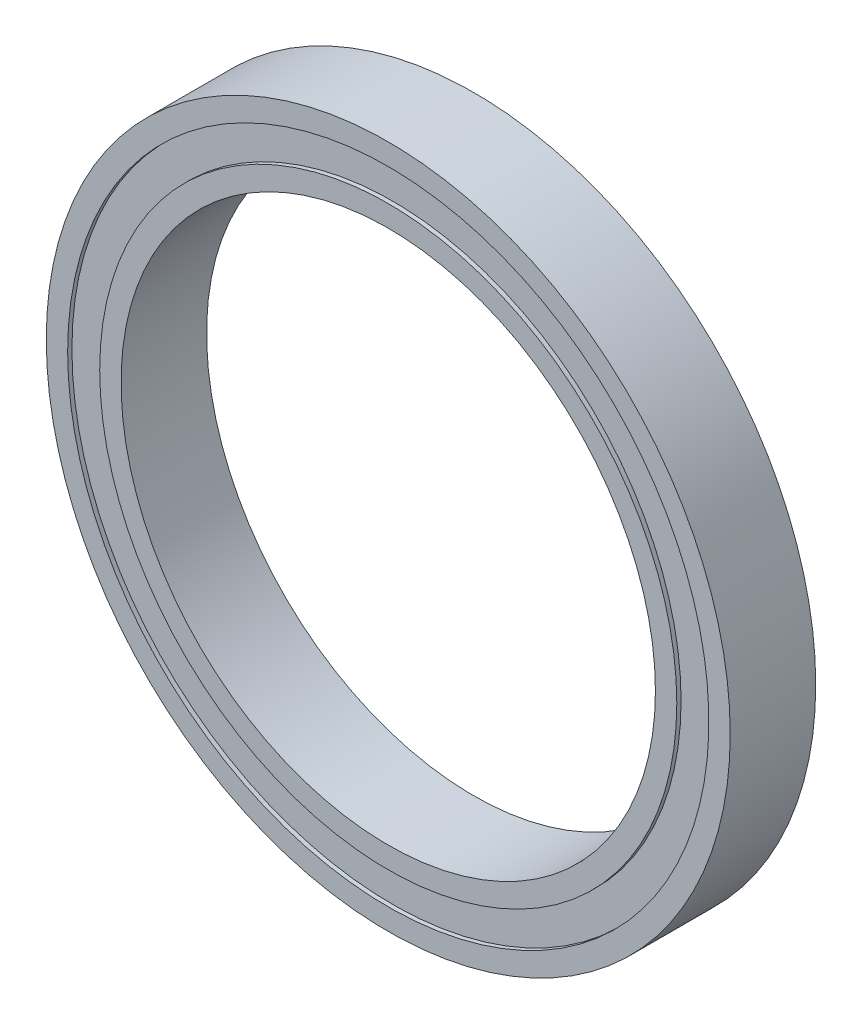
ISO-10303-21;
HEADER;
FILE_DESCRIPTION(('STEP AP214'),'2;1');
FILE_NAME('part.step','',(''),(''),'','','');
FILE_SCHEMA(('AUTOMOTIVE_DESIGN { 1 0 10303 214 1 1 1 1 }'));
ENDSEC;
DATA;
#1=APPLICATION_CONTEXT('core data for automotive mechanical design processes');
#2=APPLICATION_PROTOCOL_DEFINITION('international standard','automotive_design',2000,#1);
#3=PRODUCT_CONTEXT('',#1,'mechanical');
#4=PRODUCT('Part','Part','',(#3));
#5=PRODUCT_RELATED_PRODUCT_CATEGORY('part','',(#4));
#6=PRODUCT_DEFINITION_FORMATION('','',#4);
#7=PRODUCT_DEFINITION_CONTEXT('part definition',#1,'design');
#8=PRODUCT_DEFINITION('design','',#6,#7);
#9=PRODUCT_DEFINITION_SHAPE('','',#8);
#10=(LENGTH_UNIT() NAMED_UNIT(*) SI_UNIT(.MILLI.,.METRE.));
#11=(NAMED_UNIT(*) PLANE_ANGLE_UNIT() SI_UNIT($,.RADIAN.));
#12=(NAMED_UNIT(*) SI_UNIT($,.STERADIAN.) SOLID_ANGLE_UNIT());
#13=UNCERTAINTY_MEASURE_WITH_UNIT(LENGTH_MEASURE(1.E-05),#10,'distance_accuracy_value','');
#14=(GEOMETRIC_REPRESENTATION_CONTEXT(3) GLOBAL_UNCERTAINTY_ASSIGNED_CONTEXT((#13)) GLOBAL_UNIT_ASSIGNED_CONTEXT((#10,
#11,#12)) REPRESENTATION_CONTEXT('',''));
#15=CARTESIAN_POINT('',(0.,0.,0.));
#16=DIRECTION('',(0.,0.,1.));
#17=DIRECTION('',(1.,0.,0.));
#18=AXIS2_PLACEMENT_3D('',#15,#16,#17);
#19=CARTESIAN_POINT('',(0.,0.,2.));
#20=DIRECTION('',(0.,0.,1.));
#21=DIRECTION('',(1.,0.,0.));
#22=AXIS2_PLACEMENT_3D('',#19,#20,#21);
#23=PLANE('',#22);
#24=CARTESIAN_POINT('',(0.,0.,2.));
#25=DIRECTION('',(0.,0.,1.));
#26=DIRECTION('',(1.,0.,0.));
#27=AXIS2_PLACEMENT_3D('',#24,#25,#26);
#28=CIRCLE('',#27,12.5);
#29=CARTESIAN_POINT('',(12.5,0.,2.));
#30=VERTEX_POINT('',#29);
#31=EDGE_CURVE('E43',#30,#30,#28,.T.);
#32=ORIENTED_EDGE('',*,*,#31,.F.);
#33=EDGE_LOOP('',(#32));
#34=FACE_BOUND('',#33,.T.);
#35=CARTESIAN_POINT('',(0.,0.,2.));
#36=DIRECTION('',(0.,0.,-1.));
#37=DIRECTION('',(-1.,0.,0.));
#38=AXIS2_PLACEMENT_3D('',#35,#36,#37);
#39=CIRCLE('',#38,13.5);
#40=CARTESIAN_POINT('',(-13.5,0.,2.));
#41=VERTEX_POINT('',#40);
#42=EDGE_CURVE('E66',#41,#41,#39,.T.);
#43=ORIENTED_EDGE('',*,*,#42,.F.);
#44=EDGE_LOOP('',(#43));
#45=FACE_BOUND('',#44,.T.);
#46=ADVANCED_FACE('F32',(#34,#45),#23,.T.);
#47=CARTESIAN_POINT('',(0.,0.,-2.));
#48=DIRECTION('',(0.,0.,1.));
#49=DIRECTION('',(1.,0.,0.));
#50=AXIS2_PLACEMENT_3D('',#47,#48,#49);
#51=PLANE('',#50);
#52=CARTESIAN_POINT('',(0.,0.,-2.));
#53=DIRECTION('',(0.,0.,-1.));
#54=DIRECTION('',(-1.,0.,0.));
#55=AXIS2_PLACEMENT_3D('',#52,#53,#54);
#56=CIRCLE('',#55,13.5);
#57=CARTESIAN_POINT('',(-13.5,0.,-2.));
#58=VERTEX_POINT('',#57);
#59=EDGE_CURVE('E51',#58,#58,#56,.T.);
#60=ORIENTED_EDGE('',*,*,#59,.T.);
#61=EDGE_LOOP('',(#60));
#62=FACE_BOUND('',#61,.T.);
#63=CARTESIAN_POINT('',(0.,0.,-2.));
#64=DIRECTION('',(0.,0.,1.));
#65=DIRECTION('',(1.,0.,0.));
#66=AXIS2_PLACEMENT_3D('',#63,#64,#65);
#67=CIRCLE('',#66,12.5);
#68=CARTESIAN_POINT('',(12.5,0.,-2.));
#69=VERTEX_POINT('',#68);
#70=EDGE_CURVE('E45',#69,#69,#67,.T.);
#71=ORIENTED_EDGE('',*,*,#70,.T.);
#72=EDGE_LOOP('',(#71));
#73=FACE_BOUND('',#72,.T.);
#74=ADVANCED_FACE('F91',(#62,#73),#51,.F.);
#75=CARTESIAN_POINT('',(0.,0.,2.));
#76=DIRECTION('',(0.,0.,-1.));
#77=DIRECTION('',(-1.,0.,0.));
#78=AXIS2_PLACEMENT_3D('',#75,#76,#77);
#79=CYLINDRICAL_SURFACE('',#78,12.5);
#80=ORIENTED_EDGE('',*,*,#31,.T.);
#81=EDGE_LOOP('',(#80));
#82=FACE_BOUND('',#81,.T.);
#83=ORIENTED_EDGE('',*,*,#70,.F.);
#84=EDGE_LOOP('',(#83));
#85=FACE_BOUND('',#84,.T.);
#86=ADVANCED_FACE('F97',(#82,#85),#79,.F.);
#87=CARTESIAN_POINT('',(0.,0.,0.));
#88=DIRECTION('',(0.,0.,-1.));
#89=DIRECTION('',(-1.,0.,0.));
#90=AXIS2_PLACEMENT_3D('',#87,#88,#89);
#91=CYLINDRICAL_SURFACE('',#90,13.5);
#92=ORIENTED_EDGE('',*,*,#59,.F.);
#93=EDGE_LOOP('',(#92));
#94=FACE_BOUND('',#93,.T.);
#95=CARTESIAN_POINT('',(0.,0.,-1.8));
#96=DIRECTION('',(0.,0.,-1.));
#97=DIRECTION('',(-1.,0.,0.));
#98=AXIS2_PLACEMENT_3D('',#95,#96,#97);
#99=CIRCLE('',#98,13.5);
#100=CARTESIAN_POINT('',(-13.5,0.,-1.8));
#101=VERTEX_POINT('',#100);
#102=EDGE_CURVE('E55',#101,#101,#99,.T.);
#103=ORIENTED_EDGE('',*,*,#102,.T.);
#104=EDGE_LOOP('',(#103));
#105=FACE_BOUND('',#104,.T.);
#106=ADVANCED_FACE('F122',(#94,#105),#91,.T.);
#107=CARTESIAN_POINT('',(0.,15.,-1.8));
#108=DIRECTION('',(0.,0.,1.));
#109=DIRECTION('',(1.,0.,0.));
#110=AXIS2_PLACEMENT_3D('',#107,#108,#109);
#111=PLANE('',#110);
#112=ORIENTED_EDGE('',*,*,#102,.F.);
#113=EDGE_LOOP('',(#112));
#114=FACE_BOUND('',#113,.T.);
#115=CARTESIAN_POINT('',(0.,0.,-1.8));
#116=DIRECTION('',(0.,0.,-1.));
#117=DIRECTION('',(-1.,0.,0.));
#118=AXIS2_PLACEMENT_3D('',#115,#116,#117);
#119=CIRCLE('',#118,15.);
#120=CARTESIAN_POINT('',(-15.,0.,-1.8));
#121=VERTEX_POINT('',#120);
#122=EDGE_CURVE('E58',#121,#121,#119,.T.);
#123=ORIENTED_EDGE('',*,*,#122,.T.);
#124=EDGE_LOOP('',(#123));
#125=FACE_BOUND('',#124,.T.);
#126=ADVANCED_FACE('F116',(#114,#125),#111,.F.);
#127=CARTESIAN_POINT('',(0.,0.,0.));
#128=DIRECTION('',(0.,0.,-1.));
#129=DIRECTION('',(-1.,0.,0.));
#130=AXIS2_PLACEMENT_3D('',#127,#128,#129);
#131=CYLINDRICAL_SURFACE('',#130,15.);
#132=ORIENTED_EDGE('',*,*,#122,.F.);
#133=EDGE_LOOP('',(#132));
#134=FACE_BOUND('',#133,.T.);
#135=CARTESIAN_POINT('',(0.,0.,-2.));
#136=DIRECTION('',(0.,0.,-1.));
#137=DIRECTION('',(-1.,0.,0.));
#138=AXIS2_PLACEMENT_3D('',#135,#136,#137);
#139=CIRCLE('',#138,15.);
#140=CARTESIAN_POINT('',(-15.,0.,-2.));
#141=VERTEX_POINT('',#140);
#142=EDGE_CURVE('E61',#141,#141,#139,.T.);
#143=ORIENTED_EDGE('',*,*,#142,.T.);
#144=EDGE_LOOP('',(#143));
#145=FACE_BOUND('',#144,.T.);
#146=ADVANCED_FACE('F111',(#134,#145),#131,.F.);
#147=CARTESIAN_POINT('',(0.,0.,0.));
#148=DIRECTION('',(0.,0.,-1.));
#149=DIRECTION('',(-1.,0.,0.));
#150=AXIS2_PLACEMENT_3D('',#147,#148,#149);
#151=CYLINDRICAL_SURFACE('',#150,15.);
#152=CARTESIAN_POINT('',(0.,0.,2.));
#153=DIRECTION('',(0.,0.,-1.));
#154=DIRECTION('',(-1.,0.,0.));
#155=AXIS2_PLACEMENT_3D('',#152,#153,#154);
#156=CIRCLE('',#155,15.);
#157=CARTESIAN_POINT('',(-15.,0.,2.));
#158=VERTEX_POINT('',#157);
#159=EDGE_CURVE('E48',#158,#158,#156,.T.);
#160=ORIENTED_EDGE('',*,*,#159,.F.);
#161=EDGE_LOOP('',(#160));
#162=FACE_BOUND('',#161,.T.);
#163=CARTESIAN_POINT('',(0.,0.,1.8));
#164=DIRECTION('',(0.,0.,-1.));
#165=DIRECTION('',(-1.,0.,0.));
#166=AXIS2_PLACEMENT_3D('',#163,#164,#165);
#167=CIRCLE('',#166,15.);
#168=CARTESIAN_POINT('',(-15.,0.,1.8));
#169=VERTEX_POINT('',#168);
#170=EDGE_CURVE('E54',#169,#169,#167,.T.);
#171=ORIENTED_EDGE('',*,*,#170,.T.);
#172=EDGE_LOOP('',(#171));
#173=FACE_BOUND('',#172,.T.);
#174=ADVANCED_FACE('F75',(#162,#173),#151,.F.);
#175=CARTESIAN_POINT('',(0.,0.,0.));
#176=DIRECTION('',(0.,0.,-1.));
#177=DIRECTION('',(-1.,0.,0.));
#178=AXIS2_PLACEMENT_3D('',#175,#176,#177);
#179=CYLINDRICAL_SURFACE('',#178,13.5);
#180=CARTESIAN_POINT('',(0.,0.,1.8));
#181=DIRECTION('',(0.,0.,-1.));
#182=DIRECTION('',(-1.,0.,0.));
#183=AXIS2_PLACEMENT_3D('',#180,#181,#182);
#184=CIRCLE('',#183,13.5);
#185=CARTESIAN_POINT('',(-13.5,0.,1.8));
#186=VERTEX_POINT('',#185);
#187=EDGE_CURVE('E69',#186,#186,#184,.T.);
#188=ORIENTED_EDGE('',*,*,#187,.F.);
#189=EDGE_LOOP('',(#188));
#190=FACE_BOUND('',#189,.T.);
#191=ORIENTED_EDGE('',*,*,#42,.T.);
#192=EDGE_LOOP('',(#191));
#193=FACE_BOUND('',#192,.T.);
#194=ADVANCED_FACE('F81',(#190,#193),#179,.T.);
#195=CARTESIAN_POINT('',(0.,15.,1.8));
#196=DIRECTION('',(0.,0.,-1.));
#197=DIRECTION('',(-1.,0.,0.));
#198=AXIS2_PLACEMENT_3D('',#195,#196,#197);
#199=PLANE('',#198);
#200=ORIENTED_EDGE('',*,*,#170,.F.);
#201=EDGE_LOOP('',(#200));
#202=FACE_BOUND('',#201,.T.);
#203=ORIENTED_EDGE('',*,*,#187,.T.);
#204=EDGE_LOOP('',(#203));
#205=FACE_BOUND('',#204,.T.);
#206=ADVANCED_FACE('F77',(#202,#205),#199,.F.);
#207=CARTESIAN_POINT('',(0.,0.,2.));
#208=DIRECTION('',(0.,0.,1.));
#209=DIRECTION('',(1.,0.,0.));
#210=AXIS2_PLACEMENT_3D('',#207,#208,#209);
#211=CIRCLE('',#210,16.);
#212=CARTESIAN_POINT('',(16.,0.,2.));
#213=VERTEX_POINT('',#212);
#214=EDGE_CURVE('E10',#213,#213,#211,.T.);
#215=ORIENTED_EDGE('',*,*,#214,.T.);
#216=EDGE_LOOP('',(#215));
#217=FACE_BOUND('',#216,.T.);
#218=ORIENTED_EDGE('',*,*,#159,.T.);
#219=EDGE_LOOP('',(#218));
#220=FACE_BOUND('',#219,.T.);
#221=ADVANCED_FACE('F80',(#217,#220),#23,.T.);
#222=CARTESIAN_POINT('',(0.,0.,2.));
#223=DIRECTION('',(0.,0.,-1.));
#224=DIRECTION('',(-1.,0.,0.));
#225=AXIS2_PLACEMENT_3D('',#222,#223,#224);
#226=CYLINDRICAL_SURFACE('',#225,16.);
#227=ORIENTED_EDGE('',*,*,#214,.F.);
#228=EDGE_LOOP('',(#227));
#229=FACE_BOUND('',#228,.T.);
#230=CARTESIAN_POINT('',(0.,0.,-2.));
#231=DIRECTION('',(0.,0.,1.));
#232=DIRECTION('',(1.,0.,0.));
#233=AXIS2_PLACEMENT_3D('',#230,#231,#232);
#234=CIRCLE('',#233,16.);
#235=CARTESIAN_POINT('',(16.,0.,-2.));
#236=VERTEX_POINT('',#235);
#237=EDGE_CURVE('E36',#236,#236,#234,.T.);
#238=ORIENTED_EDGE('',*,*,#237,.T.);
#239=EDGE_LOOP('',(#238));
#240=FACE_BOUND('',#239,.T.);
#241=ADVANCED_FACE('F34',(#229,#240),#226,.T.);
#242=ORIENTED_EDGE('',*,*,#142,.F.);
#243=EDGE_LOOP('',(#242));
#244=FACE_BOUND('',#243,.T.);
#245=ORIENTED_EDGE('',*,*,#237,.F.);
#246=EDGE_LOOP('',(#245));
#247=FACE_BOUND('',#246,.T.);
#248=ADVANCED_FACE('F99',(#244,#247),#51,.F.);
#249=CLOSED_SHELL('',(#46,#74,#86,#106,#126,#146,#174,#194,#206,#221,#241,#248));
#250=MANIFOLD_SOLID_BREP('B2',#249);
#251=ADVANCED_BREP_SHAPE_REPRESENTATION('',(#18,#250),#14);
#252=SHAPE_DEFINITION_REPRESENTATION(#9,#251);
ENDSEC;
END-ISO-10303-21;
